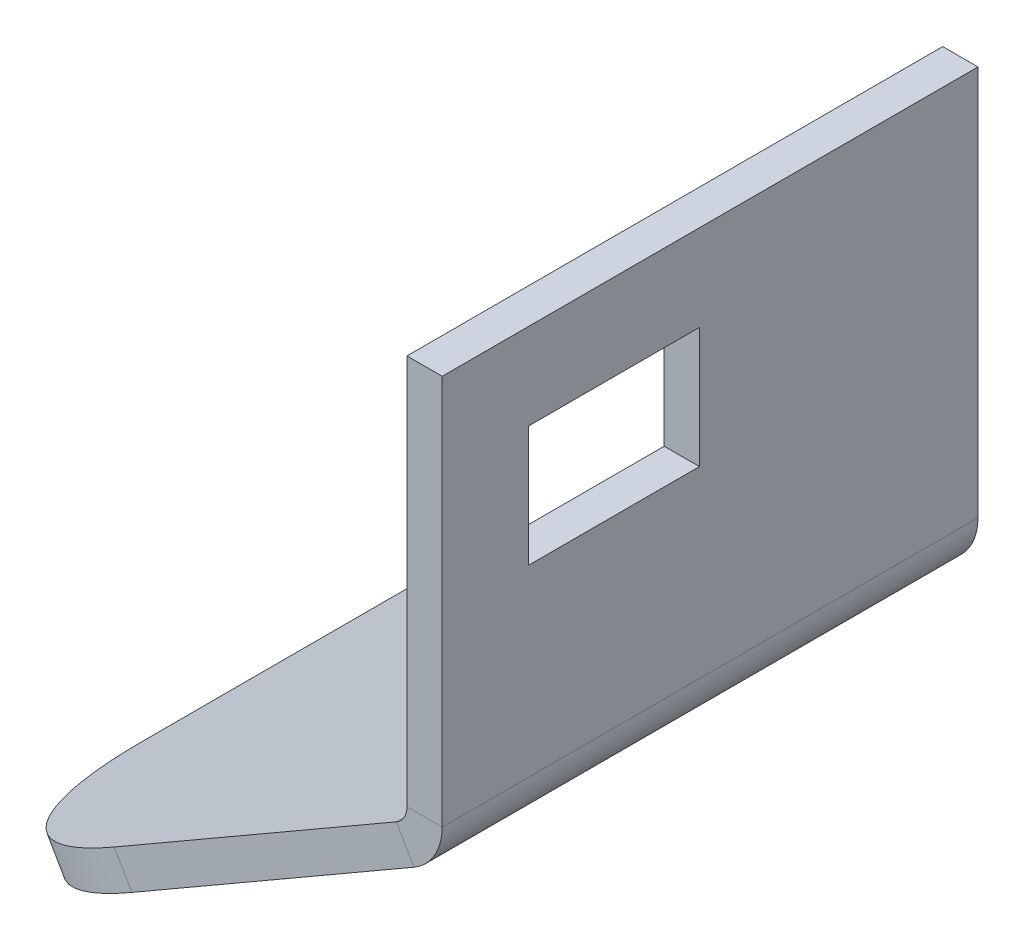
ISO-10303-21;
HEADER;
FILE_DESCRIPTION(('STEP AP214'),'2;1');
FILE_NAME('part.step','',(''),(''),'','','');
FILE_SCHEMA(('AUTOMOTIVE_DESIGN { 1 0 10303 214 1 1 1 1 }'));
ENDSEC;
DATA;
#1=APPLICATION_CONTEXT('core data for automotive mechanical design processes');
#2=APPLICATION_PROTOCOL_DEFINITION('international standard','automotive_design',2000,#1);
#3=PRODUCT_CONTEXT('',#1,'mechanical');
#4=PRODUCT('Part','Part','',(#3));
#5=PRODUCT_RELATED_PRODUCT_CATEGORY('part','',(#4));
#6=PRODUCT_DEFINITION_FORMATION('','',#4);
#7=PRODUCT_DEFINITION_CONTEXT('part definition',#1,'design');
#8=PRODUCT_DEFINITION('design','',#6,#7);
#9=PRODUCT_DEFINITION_SHAPE('','',#8);
#10=(LENGTH_UNIT() NAMED_UNIT(*) SI_UNIT(.MILLI.,.METRE.));
#11=(NAMED_UNIT(*) PLANE_ANGLE_UNIT() SI_UNIT($,.RADIAN.));
#12=(NAMED_UNIT(*) SI_UNIT($,.STERADIAN.) SOLID_ANGLE_UNIT());
#13=UNCERTAINTY_MEASURE_WITH_UNIT(LENGTH_MEASURE(1.E-05),#10,'distance_accuracy_value','');
#14=(GEOMETRIC_REPRESENTATION_CONTEXT(3) GLOBAL_UNCERTAINTY_ASSIGNED_CONTEXT((#13)) GLOBAL_UNIT_ASSIGNED_CONTEXT((#10,
#11,#12)) REPRESENTATION_CONTEXT('',''));
#15=CARTESIAN_POINT('',(0.,0.,0.));
#16=DIRECTION('',(0.,0.,1.));
#17=DIRECTION('',(1.,0.,0.));
#18=AXIS2_PLACEMENT_3D('',#15,#16,#17);
#19=CARTESIAN_POINT('',(-3.99999999999997,-2.30940107675851,76.));
#20=DIRECTION('',(0.,0.,1.));
#21=DIRECTION('',(1.,0.,0.));
#22=AXIS2_PLACEMENT_3D('',#19,#20,#21);
#23=PLANE('',#22);
#24=DIRECTION('',(-0.500000000000004,0.866025403784436,0.));
#25=VECTOR('',#24,1.);
#26=CARTESIAN_POINT('',(-3.99999999999997,-2.30940107675851,76.));
#27=LINE('',#26,#25);
#28=CARTESIAN_POINT('',(-3.99999999999997,-2.30940107675851,76.));
#29=VERTEX_POINT('',#28);
#30=CARTESIAN_POINT('',(-6.49999999999999,2.02072594216367,76.));
#31=VERTEX_POINT('',#30);
#32=EDGE_CURVE('E235',#29,#31,#27,.T.);
#33=ORIENTED_EDGE('',*,*,#32,.F.);
#34=CARTESIAN_POINT('',(-8.,4.61880215351698,76.));
#35=DIRECTION('',(0.,0.,1.));
#36=DIRECTION('',(1.,0.,0.));
#37=AXIS2_PLACEMENT_3D('',#34,#35,#36);
#38=CIRCLE('',#37,8.);
#39=CARTESIAN_POINT('',(0.,4.61880215351698,76.));
#40=VERTEX_POINT('',#39);
#41=EDGE_CURVE('E172',#40,#29,#38,.F.);
#42=ORIENTED_EDGE('',*,*,#41,.F.);
#43=DIRECTION('',(1.,0.,0.));
#44=VECTOR('',#43,1.);
#45=CARTESIAN_POINT('',(-5.,4.61880215351698,76.));
#46=LINE('',#45,#44);
#47=CARTESIAN_POINT('',(-5.,4.61880215351698,76.));
#48=VERTEX_POINT('',#47);
#49=EDGE_CURVE('E233',#48,#40,#46,.T.);
#50=ORIENTED_EDGE('',*,*,#49,.F.);
#51=CARTESIAN_POINT('',(-8.,4.61880215351698,76.));
#52=DIRECTION('',(0.,0.,1.));
#53=DIRECTION('',(1.,0.,0.));
#54=AXIS2_PLACEMENT_3D('',#51,#52,#53);
#55=CIRCLE('',#54,3.);
#56=EDGE_CURVE('E184',#48,#31,#55,.F.);
#57=ORIENTED_EDGE('',*,*,#56,.T.);
#58=EDGE_LOOP('',(#33,#42,#50,#57));
#59=FACE_BOUND('',#58,.T.);
#60=ADVANCED_FACE('F36',(#59),#23,.T.);
#61=CARTESIAN_POINT('',(-5.,4.61880215351698,76.));
#62=DIRECTION('',(0.,0.,1.));
#63=DIRECTION('',(1.,0.,0.));
#64=AXIS2_PLACEMENT_3D('',#61,#62,#63);
#65=PLANE('',#64);
#66=DIRECTION('',(-0.866025403784436,-0.500000000000004,0.));
#67=VECTOR('',#66,1.);
#68=CARTESIAN_POINT('',(-2.50000000000002,4.33012701892218,76.));
#69=LINE('',#68,#67);
#70=CARTESIAN_POINT('',(-46.519237886467,-21.084391824352,76.));
#71=VERTEX_POINT('',#70);
#72=EDGE_CURVE('E165',#31,#71,#69,.T.);
#73=ORIENTED_EDGE('',*,*,#72,.T.);
#74=DIRECTION('',(-0.500000000000006,0.866025403784435,0.));
#75=VECTOR('',#74,1.);
#76=CARTESIAN_POINT('',(-47.2692378864669,-19.7853537186754,76.));
#77=LINE('',#76,#75);
#78=CARTESIAN_POINT('',(-44.0192378864669,-25.4145188432741,76.));
#79=VERTEX_POINT('',#78);
#80=EDGE_CURVE('E44',#71,#79,#77,.F.);
#81=ORIENTED_EDGE('',*,*,#80,.T.);
#82=DIRECTION('',(-0.866025403784436,-0.500000000000004,0.));
#83=VECTOR('',#82,1.);
#84=CARTESIAN_POINT('',(0.,0.,76.));
#85=LINE('',#84,#83);
#86=EDGE_CURVE('E168',#29,#79,#85,.T.);
#87=ORIENTED_EDGE('',*,*,#86,.F.);
#88=ORIENTED_EDGE('',*,*,#32,.T.);
#89=EDGE_LOOP('',(#73,#81,#87,#88));
#90=FACE_BOUND('',#89,.T.);
#91=ADVANCED_FACE('F244',(#90),#65,.T.);
#92=CARTESIAN_POINT('',(0.,4.61880215351698,0.));
#93=DIRECTION('',(0.,0.,-1.));
#94=DIRECTION('',(-1.,0.,0.));
#95=AXIS2_PLACEMENT_3D('',#92,#93,#94);
#96=PLANE('',#95);
#97=DIRECTION('',(-1.,0.,0.));
#98=VECTOR('',#97,1.);
#99=CARTESIAN_POINT('',(0.,4.61880215351698,0.));
#100=LINE('',#99,#98);
#101=CARTESIAN_POINT('',(0.,4.61880215351698,0.));
#102=VERTEX_POINT('',#101);
#103=CARTESIAN_POINT('',(-5.,4.61880215351698,0.));
#104=VERTEX_POINT('',#103);
#105=EDGE_CURVE('E231',#102,#104,#100,.T.);
#106=ORIENTED_EDGE('',*,*,#105,.F.);
#107=CARTESIAN_POINT('',(-8.,4.61880215351698,0.));
#108=DIRECTION('',(0.,0.,1.));
#109=DIRECTION('',(1.,0.,0.));
#110=AXIS2_PLACEMENT_3D('',#107,#108,#109);
#111=CIRCLE('',#110,8.);
#112=CARTESIAN_POINT('',(-3.99999999999997,-2.30940107675851,0.));
#113=VERTEX_POINT('',#112);
#114=EDGE_CURVE('E196',#102,#113,#111,.F.);
#115=ORIENTED_EDGE('',*,*,#114,.T.);
#116=DIRECTION('',(0.500000000000004,-0.866025403784436,0.));
#117=VECTOR('',#116,1.);
#118=CARTESIAN_POINT('',(-6.49999999999999,2.02072594216367,0.));
#119=LINE('',#118,#117);
#120=CARTESIAN_POINT('',(-6.49999999999999,2.02072594216367,0.));
#121=VERTEX_POINT('',#120);
#122=EDGE_CURVE('E229',#121,#113,#119,.T.);
#123=ORIENTED_EDGE('',*,*,#122,.F.);
#124=CARTESIAN_POINT('',(-8.,4.61880215351698,0.));
#125=DIRECTION('',(0.,0.,1.));
#126=DIRECTION('',(1.,0.,0.));
#127=AXIS2_PLACEMENT_3D('',#124,#125,#126);
#128=CIRCLE('',#127,3.);
#129=EDGE_CURVE('E169',#104,#121,#128,.F.);
#130=ORIENTED_EDGE('',*,*,#129,.F.);
#131=EDGE_LOOP('',(#106,#115,#123,#130));
#132=FACE_BOUND('',#131,.T.);
#133=ADVANCED_FACE('F266',(#132),#96,.T.);
#134=CARTESIAN_POINT('',(-6.49999999999999,2.02072594216367,0.));
#135=DIRECTION('',(0.,0.,-1.));
#136=DIRECTION('',(-1.,0.,0.));
#137=AXIS2_PLACEMENT_3D('',#134,#135,#136);
#138=PLANE('',#137);
#139=DIRECTION('',(0.,-1.,0.));
#140=VECTOR('',#139,1.);
#141=CARTESIAN_POINT('',(0.,0.,0.));
#142=LINE('',#141,#140);
#143=CARTESIAN_POINT('',(0.,60.,0.));
#144=VERTEX_POINT('',#143);
#145=EDGE_CURVE('E199',#144,#102,#142,.T.);
#146=ORIENTED_EDGE('',*,*,#145,.T.);
#147=ORIENTED_EDGE('',*,*,#105,.T.);
#148=DIRECTION('',(0.,1.,0.));
#149=VECTOR('',#148,1.);
#150=CARTESIAN_POINT('',(-5.,0.,0.));
#151=LINE('',#150,#149);
#152=CARTESIAN_POINT('',(-5.,60.,0.));
#153=VERTEX_POINT('',#152);
#154=EDGE_CURVE('E205',#153,#104,#151,.F.);
#155=ORIENTED_EDGE('',*,*,#154,.F.);
#156=DIRECTION('',(1.,0.,0.));
#157=VECTOR('',#156,1.);
#158=CARTESIAN_POINT('',(-5.,60.,0.));
#159=LINE('',#158,#157);
#160=EDGE_CURVE('E202',#153,#144,#159,.T.);
#161=ORIENTED_EDGE('',*,*,#160,.T.);
#162=EDGE_LOOP('',(#146,#147,#155,#161));
#163=FACE_BOUND('',#162,.T.);
#164=ADVANCED_FACE('F274',(#163),#138,.T.);
#165=CARTESIAN_POINT('',(-2.50000000000002,4.33012701892218,76.));
#166=DIRECTION('',(0.500000000000004,-0.866025403784436,0.));
#167=DIRECTION('',(0.866025403784436,0.500000000000004,0.));
#168=AXIS2_PLACEMENT_3D('',#165,#166,#167);
#169=PLANE('',#168);
#170=DIRECTION('',(0.,0.,-1.));
#171=VECTOR('',#170,1.);
#172=CARTESIAN_POINT('',(-72.5,-36.0843918243521,76.));
#173=LINE('',#172,#171);
#174=CARTESIAN_POINT('',(-72.5,-36.0843918243521,46.));
#175=VERTEX_POINT('',#174);
#176=CARTESIAN_POINT('',(-72.5,-36.0843918243521,0.));
#177=VERTEX_POINT('',#176);
#178=EDGE_CURVE('E227',#175,#177,#173,.T.);
#179=ORIENTED_EDGE('',*,*,#178,.F.);
#180=CARTESIAN_POINT('',(-46.519237886467,-21.084391824352,46.));
#181=DIRECTION('',(0.500000000000004,-0.866025403784436,0.));
#182=DIRECTION('',(0.866025403784436,0.500000000000004,0.));
#183=AXIS2_PLACEMENT_3D('',#180,#181,#182);
#184=CIRCLE('',#183,30.);
#185=EDGE_CURVE('E240',#175,#71,#184,.F.);
#186=ORIENTED_EDGE('',*,*,#185,.T.);
#187=ORIENTED_EDGE('',*,*,#72,.F.);
#188=DIRECTION('',(0.,0.,-1.));
#189=VECTOR('',#188,1.);
#190=CARTESIAN_POINT('',(-6.49999999999999,2.02072594216367,76.));
#191=LINE('',#190,#189);
#192=EDGE_CURVE('E187',#31,#121,#191,.T.);
#193=ORIENTED_EDGE('',*,*,#192,.T.);
#194=DIRECTION('',(-0.866025403784436,-0.500000000000004,0.));
#195=VECTOR('',#194,1.);
#196=CARTESIAN_POINT('',(-2.50000000000002,4.33012701892218,0.));
#197=LINE('',#196,#195);
#198=EDGE_CURVE('E136',#121,#177,#197,.T.);
#199=ORIENTED_EDGE('',*,*,#198,.T.);
#200=EDGE_LOOP('',(#179,#186,#187,#193,#199));
#201=FACE_BOUND('',#200,.T.);
#202=ADVANCED_FACE('F259',(#201),#169,.F.);
#203=CARTESIAN_POINT('',(-70.,-40.4145188432743,76.));
#204=DIRECTION('',(-0.866025403784435,-0.500000000000006,0.));
#205=DIRECTION('',(0.500000000000006,-0.866025403784435,0.));
#206=AXIS2_PLACEMENT_3D('',#203,#204,#205);
#207=PLANE('',#206);
#208=DIRECTION('',(0.,0.,-1.));
#209=VECTOR('',#208,1.);
#210=CARTESIAN_POINT('',(-70.,-40.4145188432743,76.));
#211=LINE('',#210,#209);
#212=CARTESIAN_POINT('',(-70.,-40.4145188432743,46.));
#213=VERTEX_POINT('',#212);
#214=CARTESIAN_POINT('',(-70.,-40.4145188432743,0.));
#215=VERTEX_POINT('',#214);
#216=EDGE_CURVE('E225',#213,#215,#211,.T.);
#217=ORIENTED_EDGE('',*,*,#216,.F.);
#218=DIRECTION('',(-0.500000000000006,0.866025403784435,0.));
#219=VECTOR('',#218,1.);
#220=CARTESIAN_POINT('',(-70.,-40.4145188432743,46.));
#221=LINE('',#220,#219);
#222=EDGE_CURVE('E237',#213,#175,#221,.T.);
#223=ORIENTED_EDGE('',*,*,#222,.T.);
#224=ORIENTED_EDGE('',*,*,#178,.T.);
#225=DIRECTION('',(-0.500000000000006,0.866025403784435,0.));
#226=VECTOR('',#225,1.);
#227=CARTESIAN_POINT('',(-70.,-40.4145188432743,0.));
#228=LINE('',#227,#226);
#229=EDGE_CURVE('E190',#215,#177,#228,.T.);
#230=ORIENTED_EDGE('',*,*,#229,.F.);
#231=EDGE_LOOP('',(#217,#223,#224,#230));
#232=FACE_BOUND('',#231,.T.);
#233=ADVANCED_FACE('F256',(#232),#207,.T.);
#234=CARTESIAN_POINT('',(0.,0.,76.));
#235=DIRECTION('',(0.500000000000004,-0.866025403784436,0.));
#236=DIRECTION('',(0.866025403784436,0.500000000000004,0.));
#237=AXIS2_PLACEMENT_3D('',#234,#235,#236);
#238=PLANE('',#237);
#239=ORIENTED_EDGE('',*,*,#86,.T.);
#240=CARTESIAN_POINT('',(-44.0192378864669,-25.4145188432741,46.));
#241=DIRECTION('',(0.500000000000004,-0.866025403784436,0.));
#242=DIRECTION('',(0.866025403784436,0.500000000000004,0.));
#243=AXIS2_PLACEMENT_3D('',#240,#241,#242);
#244=CIRCLE('',#243,30.);
#245=EDGE_CURVE('E11',#79,#213,#244,.T.);
#246=ORIENTED_EDGE('',*,*,#245,.T.);
#247=ORIENTED_EDGE('',*,*,#216,.T.);
#248=DIRECTION('',(-0.866025403784436,-0.500000000000004,0.));
#249=VECTOR('',#248,1.);
#250=CARTESIAN_POINT('',(0.,0.,0.));
#251=LINE('',#250,#249);
#252=EDGE_CURVE('E193',#113,#215,#251,.T.);
#253=ORIENTED_EDGE('',*,*,#252,.F.);
#254=DIRECTION('',(0.,0.,-1.));
#255=VECTOR('',#254,1.);
#256=CARTESIAN_POINT('',(-3.99999999999997,-2.30940107675851,76.));
#257=LINE('',#256,#255);
#258=EDGE_CURVE('E222',#29,#113,#257,.T.);
#259=ORIENTED_EDGE('',*,*,#258,.F.);
#260=EDGE_LOOP('',(#239,#246,#247,#253,#259));
#261=FACE_BOUND('',#260,.T.);
#262=ADVANCED_FACE('F250',(#261),#238,.T.);
#263=CARTESIAN_POINT('',(-8.,4.61880215351698,76.));
#264=DIRECTION('',(0.,0.,-1.));
#265=DIRECTION('',(-1.,0.,0.));
#266=AXIS2_PLACEMENT_3D('',#263,#264,#265);
#267=CYLINDRICAL_SURFACE('',#266,8.);
#268=ORIENTED_EDGE('',*,*,#114,.F.);
#269=DIRECTION('',(0.,0.,-1.));
#270=VECTOR('',#269,1.);
#271=CARTESIAN_POINT('',(0.,4.61880215351698,76.));
#272=LINE('',#271,#270);
#273=EDGE_CURVE('E219',#40,#102,#272,.T.);
#274=ORIENTED_EDGE('',*,*,#273,.F.);
#275=ORIENTED_EDGE('',*,*,#41,.T.);
#276=ORIENTED_EDGE('',*,*,#258,.T.);
#277=EDGE_LOOP('',(#268,#274,#275,#276));
#278=FACE_BOUND('',#277,.T.);
#279=ADVANCED_FACE('F270',(#278),#267,.T.);
#280=CARTESIAN_POINT('',(0.,0.,76.));
#281=DIRECTION('',(1.,0.,0.));
#282=DIRECTION('',(0.,0.,-1.));
#283=AXIS2_PLACEMENT_3D('',#280,#281,#282);
#284=PLANE('',#283);
#285=DIRECTION('',(0.,-1.,0.));
#286=VECTOR('',#285,1.);
#287=CARTESIAN_POINT('',(0.,30.6614861316206,39.5120351216747));
#288=LINE('',#287,#286);
#289=CARTESIAN_POINT('',(0.,47.7640308579339,39.5120351216747));
#290=VERTEX_POINT('',#289);
#291=CARTESIAN_POINT('',(0.,30.6614861316206,39.5120351216747));
#292=VERTEX_POINT('',#291);
#293=EDGE_CURVE('E140',#290,#292,#288,.T.);
#294=ORIENTED_EDGE('',*,*,#293,.T.);
#295=DIRECTION('',(0.,0.,1.));
#296=VECTOR('',#295,1.);
#297=CARTESIAN_POINT('',(0.,30.6614861316206,39.5120351216747));
#298=LINE('',#297,#296);
#299=CARTESIAN_POINT('',(0.,30.6614861316206,63.7350435785606));
#300=VERTEX_POINT('',#299);
#301=EDGE_CURVE('E129',#292,#300,#298,.T.);
#302=ORIENTED_EDGE('',*,*,#301,.T.);
#303=DIRECTION('',(0.,1.,0.));
#304=VECTOR('',#303,1.);
#305=CARTESIAN_POINT('',(0.,30.6614861316206,63.7350435785606));
#306=LINE('',#305,#304);
#307=CARTESIAN_POINT('',(0.,47.7640308579339,63.7350435785606));
#308=VERTEX_POINT('',#307);
#309=EDGE_CURVE('E151',#300,#308,#306,.T.);
#310=ORIENTED_EDGE('',*,*,#309,.T.);
#311=DIRECTION('',(0.,0.,-1.));
#312=VECTOR('',#311,1.);
#313=CARTESIAN_POINT('',(0.,47.7640308579339,39.5120351216747));
#314=LINE('',#313,#312);
#315=EDGE_CURVE('E147',#308,#290,#314,.T.);
#316=ORIENTED_EDGE('',*,*,#315,.T.);
#317=EDGE_LOOP('',(#294,#302,#310,#316));
#318=FACE_BOUND('',#317,.T.);
#319=ORIENTED_EDGE('',*,*,#145,.F.);
#320=DIRECTION('',(0.,0.,-1.));
#321=VECTOR('',#320,1.);
#322=CARTESIAN_POINT('',(0.,60.,76.));
#323=LINE('',#322,#321);
#324=CARTESIAN_POINT('',(0.,60.,76.));
#325=VERTEX_POINT('',#324);
#326=EDGE_CURVE('E217',#325,#144,#323,.T.);
#327=ORIENTED_EDGE('',*,*,#326,.F.);
#328=DIRECTION('',(0.,-1.,0.));
#329=VECTOR('',#328,1.);
#330=CARTESIAN_POINT('',(0.,0.,76.));
#331=LINE('',#330,#329);
#332=EDGE_CURVE('E175',#325,#40,#331,.T.);
#333=ORIENTED_EDGE('',*,*,#332,.T.);
#334=ORIENTED_EDGE('',*,*,#273,.T.);
#335=EDGE_LOOP('',(#319,#327,#333,#334));
#336=FACE_BOUND('',#335,.T.);
#337=ADVANCED_FACE('F145',(#318,#336),#284,.T.);
#338=CARTESIAN_POINT('',(-5.,60.,76.));
#339=DIRECTION('',(0.,1.,0.));
#340=DIRECTION('',(0.,0.,1.));
#341=AXIS2_PLACEMENT_3D('',#338,#339,#340);
#342=PLANE('',#341);
#343=ORIENTED_EDGE('',*,*,#160,.F.);
#344=DIRECTION('',(0.,0.,-1.));
#345=VECTOR('',#344,1.);
#346=CARTESIAN_POINT('',(-5.,60.,76.));
#347=LINE('',#346,#345);
#348=CARTESIAN_POINT('',(-5.,60.,76.));
#349=VERTEX_POINT('',#348);
#350=EDGE_CURVE('E215',#349,#153,#347,.T.);
#351=ORIENTED_EDGE('',*,*,#350,.F.);
#352=DIRECTION('',(1.,0.,0.));
#353=VECTOR('',#352,1.);
#354=CARTESIAN_POINT('',(-5.,60.,76.));
#355=LINE('',#354,#353);
#356=EDGE_CURVE('E178',#349,#325,#355,.T.);
#357=ORIENTED_EDGE('',*,*,#356,.T.);
#358=ORIENTED_EDGE('',*,*,#326,.T.);
#359=EDGE_LOOP('',(#343,#351,#357,#358));
#360=FACE_BOUND('',#359,.T.);
#361=ADVANCED_FACE('F282',(#360),#342,.T.);
#362=CARTESIAN_POINT('',(-5.,0.,76.));
#363=DIRECTION('',(1.,0.,0.));
#364=DIRECTION('',(0.,0.,-1.));
#365=AXIS2_PLACEMENT_3D('',#362,#363,#364);
#366=PLANE('',#365);
#367=DIRECTION('',(0.,0.,1.));
#368=VECTOR('',#367,1.);
#369=CARTESIAN_POINT('',(-5.,30.6614861316206,39.5120351216747));
#370=LINE('',#369,#368);
#371=CARTESIAN_POINT('',(-5.,30.6614861316206,39.5120351216747));
#372=VERTEX_POINT('',#371);
#373=CARTESIAN_POINT('',(-5.,30.6614861316206,63.7350435785606));
#374=VERTEX_POINT('',#373);
#375=EDGE_CURVE('E149',#372,#374,#370,.T.);
#376=ORIENTED_EDGE('',*,*,#375,.F.);
#377=DIRECTION('',(0.,-1.,0.));
#378=VECTOR('',#377,1.);
#379=CARTESIAN_POINT('',(-5.,30.6614861316206,39.5120351216747));
#380=LINE('',#379,#378);
#381=CARTESIAN_POINT('',(-5.,47.7640308579339,39.5120351216747));
#382=VERTEX_POINT('',#381);
#383=EDGE_CURVE('E59',#382,#372,#380,.T.);
#384=ORIENTED_EDGE('',*,*,#383,.F.);
#385=DIRECTION('',(0.,0.,-1.));
#386=VECTOR('',#385,1.);
#387=CARTESIAN_POINT('',(-5.,47.7640308579339,39.5120351216747));
#388=LINE('',#387,#386);
#389=CARTESIAN_POINT('',(-5.,47.7640308579339,63.7350435785606));
#390=VERTEX_POINT('',#389);
#391=EDGE_CURVE('E142',#390,#382,#388,.T.);
#392=ORIENTED_EDGE('',*,*,#391,.F.);
#393=DIRECTION('',(0.,1.,0.));
#394=VECTOR('',#393,1.);
#395=CARTESIAN_POINT('',(-5.,30.6614861316206,63.7350435785606));
#396=LINE('',#395,#394);
#397=EDGE_CURVE('E156',#374,#390,#396,.T.);
#398=ORIENTED_EDGE('',*,*,#397,.F.);
#399=EDGE_LOOP('',(#376,#384,#392,#398));
#400=FACE_BOUND('',#399,.T.);
#401=ORIENTED_EDGE('',*,*,#154,.T.);
#402=DIRECTION('',(0.,0.,-1.));
#403=VECTOR('',#402,1.);
#404=CARTESIAN_POINT('',(-5.,4.61880215351698,76.));
#405=LINE('',#404,#403);
#406=EDGE_CURVE('E212',#48,#104,#405,.T.);
#407=ORIENTED_EDGE('',*,*,#406,.F.);
#408=DIRECTION('',(0.,1.,0.));
#409=VECTOR('',#408,1.);
#410=CARTESIAN_POINT('',(-5.,0.,76.));
#411=LINE('',#410,#409);
#412=EDGE_CURVE('E181',#349,#48,#411,.F.);
#413=ORIENTED_EDGE('',*,*,#412,.F.);
#414=ORIENTED_EDGE('',*,*,#350,.T.);
#415=EDGE_LOOP('',(#401,#407,#413,#414));
#416=FACE_BOUND('',#415,.T.);
#417=ADVANCED_FACE('F286',(#400,#416),#366,.F.);
#418=CARTESIAN_POINT('',(-8.,4.61880215351698,76.));
#419=DIRECTION('',(0.,0.,-1.));
#420=DIRECTION('',(-1.,0.,0.));
#421=AXIS2_PLACEMENT_3D('',#418,#419,#420);
#422=CYLINDRICAL_SURFACE('',#421,3.);
#423=ORIENTED_EDGE('',*,*,#129,.T.);
#424=ORIENTED_EDGE('',*,*,#192,.F.);
#425=ORIENTED_EDGE('',*,*,#56,.F.);
#426=ORIENTED_EDGE('',*,*,#406,.T.);
#427=EDGE_LOOP('',(#423,#424,#425,#426));
#428=FACE_BOUND('',#427,.T.);
#429=ADVANCED_FACE('F289',(#428),#422,.F.);
#430=CARTESIAN_POINT('',(-8.,4.61880215351698,76.));
#431=DIRECTION('',(0.,0.,1.));
#432=DIRECTION('',(1.,0.,0.));
#433=AXIS2_PLACEMENT_3D('',#430,#431,#432);
#434=PLANE('',#433);
#435=ORIENTED_EDGE('',*,*,#412,.T.);
#436=ORIENTED_EDGE('',*,*,#49,.T.);
#437=ORIENTED_EDGE('',*,*,#332,.F.);
#438=ORIENTED_EDGE('',*,*,#356,.F.);
#439=EDGE_LOOP('',(#435,#436,#437,#438));
#440=FACE_BOUND('',#439,.T.);
#441=ADVANCED_FACE('F280',(#440),#434,.T.);
#442=CARTESIAN_POINT('',(-8.,4.61880215351698,0.));
#443=DIRECTION('',(0.,0.,1.));
#444=DIRECTION('',(1.,0.,0.));
#445=AXIS2_PLACEMENT_3D('',#442,#443,#444);
#446=PLANE('',#445);
#447=ORIENTED_EDGE('',*,*,#198,.F.);
#448=ORIENTED_EDGE('',*,*,#122,.T.);
#449=ORIENTED_EDGE('',*,*,#252,.T.);
#450=ORIENTED_EDGE('',*,*,#229,.T.);
#451=EDGE_LOOP('',(#447,#448,#449,#450));
#452=FACE_BOUND('',#451,.T.);
#453=ADVANCED_FACE('F263',(#452),#446,.F.);
#454=CARTESIAN_POINT('',(-44.019237886467,-25.4145188432741,46.));
#455=DIRECTION('',(-0.500000000000006,0.866025403784435,0.));
#456=DIRECTION('',(-0.866025403784435,-0.500000000000006,0.));
#457=AXIS2_PLACEMENT_3D('',#454,#455,#456);
#458=CYLINDRICAL_SURFACE('',#457,30.);
#459=ORIENTED_EDGE('',*,*,#245,.F.);
#460=ORIENTED_EDGE('',*,*,#80,.F.);
#461=ORIENTED_EDGE('',*,*,#185,.F.);
#462=ORIENTED_EDGE('',*,*,#222,.F.);
#463=EDGE_LOOP('',(#459,#460,#461,#462));
#464=FACE_BOUND('',#463,.T.);
#465=ADVANCED_FACE('F38',(#464),#458,.T.);
#466=CARTESIAN_POINT('',(0.00100000000000013,30.6614861316206,39.5120351216747));
#467=DIRECTION('',(0.,0.,-1.));
#468=DIRECTION('',(-1.,0.,0.));
#469=AXIS2_PLACEMENT_3D('',#466,#467,#468);
#470=PLANE('',#469);
#471=DIRECTION('',(-1.,0.,0.));
#472=VECTOR('',#471,1.);
#473=CARTESIAN_POINT('',(0.00100000000000013,47.7640308579339,39.5120351216747));
#474=LINE('',#473,#472);
#475=EDGE_CURVE('E137',#290,#382,#474,.T.);
#476=ORIENTED_EDGE('',*,*,#475,.T.);
#477=ORIENTED_EDGE('',*,*,#383,.T.);
#478=DIRECTION('',(-1.,0.,0.));
#479=VECTOR('',#478,1.);
#480=CARTESIAN_POINT('',(0.00100000000000013,30.6614861316206,39.5120351216747));
#481=LINE('',#480,#479);
#482=EDGE_CURVE('E131',#292,#372,#481,.T.);
#483=ORIENTED_EDGE('',*,*,#482,.F.);
#484=ORIENTED_EDGE('',*,*,#293,.F.);
#485=EDGE_LOOP('',(#476,#477,#483,#484));
#486=FACE_BOUND('',#485,.T.);
#487=ADVANCED_FACE('F139',(#486),#470,.F.);
#488=CARTESIAN_POINT('',(0.00100000000000013,47.7640308579339,39.5120351216747));
#489=DIRECTION('',(0.,1.,0.));
#490=DIRECTION('',(0.,0.,1.));
#491=AXIS2_PLACEMENT_3D('',#488,#489,#490);
#492=PLANE('',#491);
#493=DIRECTION('',(-1.,0.,0.));
#494=VECTOR('',#493,1.);
#495=CARTESIAN_POINT('',(0.00100000000000013,47.7640308579339,63.7350435785606));
#496=LINE('',#495,#494);
#497=EDGE_CURVE('E162',#308,#390,#496,.T.);
#498=ORIENTED_EDGE('',*,*,#497,.T.);
#499=ORIENTED_EDGE('',*,*,#391,.T.);
#500=ORIENTED_EDGE('',*,*,#475,.F.);
#501=ORIENTED_EDGE('',*,*,#315,.F.);
#502=EDGE_LOOP('',(#498,#499,#500,#501));
#503=FACE_BOUND('',#502,.T.);
#504=ADVANCED_FACE('F325',(#503),#492,.F.);
#505=CARTESIAN_POINT('',(0.00100000000000013,30.6614861316206,63.7350435785606));
#506=DIRECTION('',(0.,0.,1.));
#507=DIRECTION('',(1.,0.,0.));
#508=AXIS2_PLACEMENT_3D('',#505,#506,#507);
#509=PLANE('',#508);
#510=DIRECTION('',(-1.,0.,0.));
#511=VECTOR('',#510,1.);
#512=CARTESIAN_POINT('',(0.00100000000000013,30.6614861316206,63.7350435785606));
#513=LINE('',#512,#511);
#514=EDGE_CURVE('E51',#300,#374,#513,.T.);
#515=ORIENTED_EDGE('',*,*,#514,.T.);
#516=ORIENTED_EDGE('',*,*,#397,.T.);
#517=ORIENTED_EDGE('',*,*,#497,.F.);
#518=ORIENTED_EDGE('',*,*,#309,.F.);
#519=EDGE_LOOP('',(#515,#516,#517,#518));
#520=FACE_BOUND('',#519,.T.);
#521=ADVANCED_FACE('F328',(#520),#509,.F.);
#522=CARTESIAN_POINT('',(0.00100000000000013,30.6614861316206,39.5120351216747));
#523=DIRECTION('',(0.,-1.,0.));
#524=DIRECTION('',(0.,0.,-1.));
#525=AXIS2_PLACEMENT_3D('',#522,#523,#524);
#526=PLANE('',#525);
#527=ORIENTED_EDGE('',*,*,#482,.T.);
#528=ORIENTED_EDGE('',*,*,#375,.T.);
#529=ORIENTED_EDGE('',*,*,#514,.F.);
#530=ORIENTED_EDGE('',*,*,#301,.F.);
#531=EDGE_LOOP('',(#527,#528,#529,#530));
#532=FACE_BOUND('',#531,.T.);
#533=ADVANCED_FACE('F130',(#532),#526,.F.);
#534=CLOSED_SHELL('',(#60,#91,#133,#164,#202,#233,#262,#279,#337,#361,#417,#429,#441,#453,#465,
#487,#504,#521,#533));
#535=MANIFOLD_SOLID_BREP('B2',#534);
#536=ADVANCED_BREP_SHAPE_REPRESENTATION('',(#18,#535),#14);
#537=SHAPE_DEFINITION_REPRESENTATION(#9,#536);
ENDSEC;
END-ISO-10303-21;
